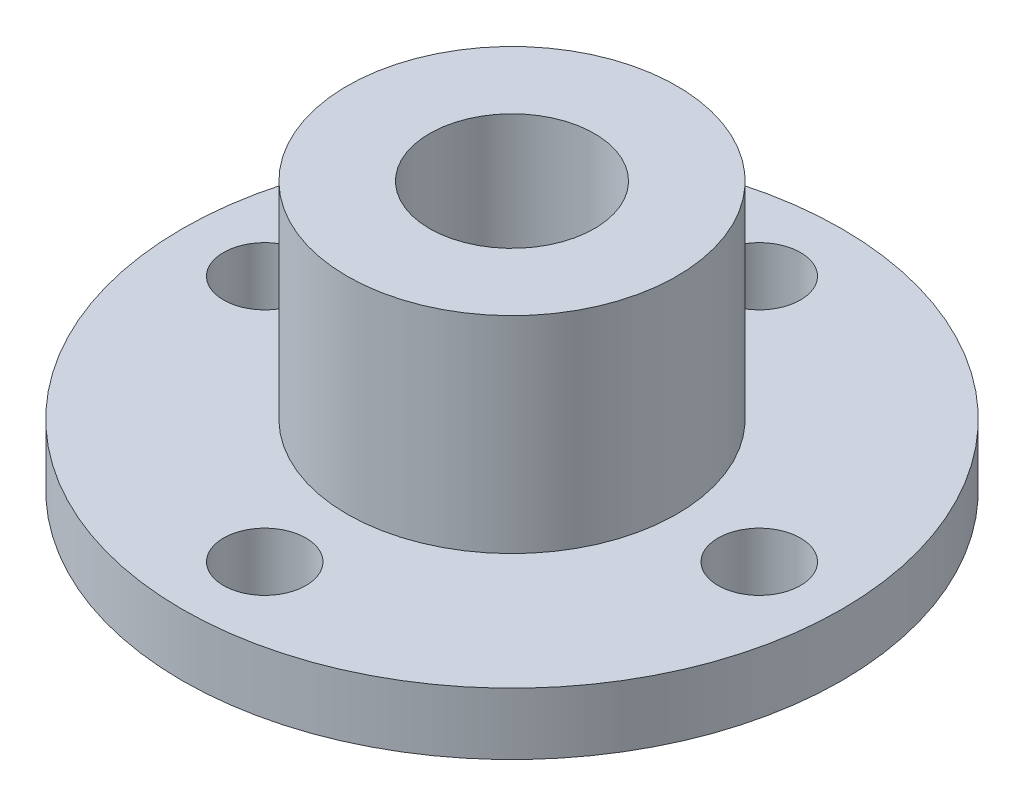
ISO-10303-21;
HEADER;
FILE_DESCRIPTION(('STEP AP214'),'2;1');
FILE_NAME('part.step','',(''),(''),'','','');
FILE_SCHEMA(('AUTOMOTIVE_DESIGN { 1 0 10303 214 1 1 1 1 }'));
ENDSEC;
DATA;
#1=APPLICATION_CONTEXT('core data for automotive mechanical design processes');
#2=APPLICATION_PROTOCOL_DEFINITION('international standard','automotive_design',2000,#1);
#3=PRODUCT_CONTEXT('',#1,'mechanical');
#4=PRODUCT('Part','Part','',(#3));
#5=PRODUCT_RELATED_PRODUCT_CATEGORY('part','',(#4));
#6=PRODUCT_DEFINITION_FORMATION('','',#4);
#7=PRODUCT_DEFINITION_CONTEXT('part definition',#1,'design');
#8=PRODUCT_DEFINITION('design','',#6,#7);
#9=PRODUCT_DEFINITION_SHAPE('','',#8);
#10=(LENGTH_UNIT() NAMED_UNIT(*) SI_UNIT(.MILLI.,.METRE.));
#11=(NAMED_UNIT(*) PLANE_ANGLE_UNIT() SI_UNIT($,.RADIAN.));
#12=(NAMED_UNIT(*) SI_UNIT($,.STERADIAN.) SOLID_ANGLE_UNIT());
#13=UNCERTAINTY_MEASURE_WITH_UNIT(LENGTH_MEASURE(1.E-05),#10,'distance_accuracy_value','');
#14=(GEOMETRIC_REPRESENTATION_CONTEXT(3) GLOBAL_UNCERTAINTY_ASSIGNED_CONTEXT((#13)) GLOBAL_UNIT_ASSIGNED_CONTEXT((#10,
#11,#12)) REPRESENTATION_CONTEXT('',''));
#15=CARTESIAN_POINT('',(0.,0.,0.));
#16=DIRECTION('',(0.,0.,1.));
#17=DIRECTION('',(1.,0.,0.));
#18=AXIS2_PLACEMENT_3D('',#15,#16,#17);
#19=CARTESIAN_POINT('',(0.,3.,0.));
#20=DIRECTION('',(0.,1.,0.));
#21=DIRECTION('',(0.,0.,1.));
#22=AXIS2_PLACEMENT_3D('',#19,#20,#21);
#23=PLANE('',#22);
#24=CARTESIAN_POINT('',(0.,3.,0.));
#25=DIRECTION('',(0.,1.,0.));
#26=DIRECTION('',(0.,0.,1.));
#27=AXIS2_PLACEMENT_3D('',#24,#25,#26);
#28=CIRCLE('',#27,8.);
#29=CARTESIAN_POINT('',(0.,3.,8.));
#30=VERTEX_POINT('',#29);
#31=EDGE_CURVE('E73',#30,#30,#28,.T.);
#32=ORIENTED_EDGE('',*,*,#31,.F.);
#33=EDGE_LOOP('',(#32));
#34=FACE_BOUND('',#33,.T.);
#35=CARTESIAN_POINT('',(0.,3.,12.));
#36=DIRECTION('',(0.,1.,0.));
#37=DIRECTION('',(0.,0.,-1.));
#38=AXIS2_PLACEMENT_3D('',#35,#36,#37);
#39=CIRCLE('',#38,2.);
#40=CARTESIAN_POINT('',(0.,3.,10.));
#41=VERTEX_POINT('',#40);
#42=EDGE_CURVE('E58',#41,#41,#39,.T.);
#43=ORIENTED_EDGE('',*,*,#42,.F.);
#44=EDGE_LOOP('',(#43));
#45=FACE_BOUND('',#44,.T.);
#46=CARTESIAN_POINT('',(-12.,3.,0.));
#47=DIRECTION('',(0.,1.,0.));
#48=DIRECTION('',(0.,0.,1.));
#49=AXIS2_PLACEMENT_3D('',#46,#47,#48);
#50=CIRCLE('',#49,2.);
#51=CARTESIAN_POINT('',(-12.,3.,2.));
#52=VERTEX_POINT('',#51);
#53=EDGE_CURVE('E47',#52,#52,#50,.T.);
#54=ORIENTED_EDGE('',*,*,#53,.F.);
#55=EDGE_LOOP('',(#54));
#56=FACE_BOUND('',#55,.T.);
#57=CARTESIAN_POINT('',(0.,3.,0.));
#58=DIRECTION('',(0.,1.,0.));
#59=DIRECTION('',(0.,0.,1.));
#60=AXIS2_PLACEMENT_3D('',#57,#58,#59);
#61=CIRCLE('',#60,16.);
#62=CARTESIAN_POINT('',(0.,3.,16.));
#63=VERTEX_POINT('',#62);
#64=EDGE_CURVE('E10',#63,#63,#61,.T.);
#65=ORIENTED_EDGE('',*,*,#64,.T.);
#66=EDGE_LOOP('',(#65));
#67=FACE_BOUND('',#66,.T.);
#68=CARTESIAN_POINT('',(12.,3.,0.));
#69=DIRECTION('',(0.,1.,0.));
#70=DIRECTION('',(0.,0.,-1.));
#71=AXIS2_PLACEMENT_3D('',#68,#69,#70);
#72=CIRCLE('',#71,2.);
#73=CARTESIAN_POINT('',(12.,3.,-2.));
#74=VERTEX_POINT('',#73);
#75=EDGE_CURVE('E52',#74,#74,#72,.T.);
#76=ORIENTED_EDGE('',*,*,#75,.F.);
#77=EDGE_LOOP('',(#76));
#78=FACE_BOUND('',#77,.T.);
#79=CARTESIAN_POINT('',(0.,3.,-12.));
#80=DIRECTION('',(0.,1.,0.));
#81=DIRECTION('',(0.,0.,1.));
#82=AXIS2_PLACEMENT_3D('',#79,#80,#81);
#83=CIRCLE('',#82,2.);
#84=CARTESIAN_POINT('',(0.,3.,-10.));
#85=VERTEX_POINT('',#84);
#86=EDGE_CURVE('E64',#85,#85,#83,.T.);
#87=ORIENTED_EDGE('',*,*,#86,.F.);
#88=EDGE_LOOP('',(#87));
#89=FACE_BOUND('',#88,.T.);
#90=ADVANCED_FACE('F36',(#34,#45,#56,#67,#78,#89),#23,.T.);
#91=CARTESIAN_POINT('',(0.,0.,0.));
#92=DIRECTION('',(0.,1.,0.));
#93=DIRECTION('',(0.,0.,1.));
#94=AXIS2_PLACEMENT_3D('',#91,#92,#93);
#95=PLANE('',#94);
#96=CARTESIAN_POINT('',(0.,0.,0.));
#97=DIRECTION('',(0.,1.,0.));
#98=DIRECTION('',(0.,0.,1.));
#99=AXIS2_PLACEMENT_3D('',#96,#97,#98);
#100=CIRCLE('',#99,4.);
#101=CARTESIAN_POINT('',(0.,0.,4.));
#102=VERTEX_POINT('',#101);
#103=EDGE_CURVE('E76',#102,#102,#100,.T.);
#104=ORIENTED_EDGE('',*,*,#103,.T.);
#105=EDGE_LOOP('',(#104));
#106=FACE_BOUND('',#105,.T.);
#107=CARTESIAN_POINT('',(0.,0.,0.));
#108=DIRECTION('',(0.,1.,0.));
#109=DIRECTION('',(0.,0.,1.));
#110=AXIS2_PLACEMENT_3D('',#107,#108,#109);
#111=CIRCLE('',#110,16.);
#112=CARTESIAN_POINT('',(0.,0.,16.));
#113=VERTEX_POINT('',#112);
#114=EDGE_CURVE('E40',#113,#113,#111,.T.);
#115=ORIENTED_EDGE('',*,*,#114,.F.);
#116=EDGE_LOOP('',(#115));
#117=FACE_BOUND('',#116,.T.);
#118=CARTESIAN_POINT('',(-12.,0.,0.));
#119=DIRECTION('',(0.,1.,0.));
#120=DIRECTION('',(0.,0.,1.));
#121=AXIS2_PLACEMENT_3D('',#118,#119,#120);
#122=CIRCLE('',#121,2.);
#123=CARTESIAN_POINT('',(-12.,0.,2.));
#124=VERTEX_POINT('',#123);
#125=EDGE_CURVE('E49',#124,#124,#122,.T.);
#126=ORIENTED_EDGE('',*,*,#125,.T.);
#127=EDGE_LOOP('',(#126));
#128=FACE_BOUND('',#127,.T.);
#129=CARTESIAN_POINT('',(12.,0.,0.));
#130=DIRECTION('',(0.,1.,0.));
#131=DIRECTION('',(0.,0.,-1.));
#132=AXIS2_PLACEMENT_3D('',#129,#130,#131);
#133=CIRCLE('',#132,2.);
#134=CARTESIAN_POINT('',(12.,0.,-2.));
#135=VERTEX_POINT('',#134);
#136=EDGE_CURVE('E55',#135,#135,#133,.T.);
#137=ORIENTED_EDGE('',*,*,#136,.T.);
#138=EDGE_LOOP('',(#137));
#139=FACE_BOUND('',#138,.T.);
#140=CARTESIAN_POINT('',(0.,0.,12.));
#141=DIRECTION('',(0.,1.,0.));
#142=DIRECTION('',(0.,0.,-1.));
#143=AXIS2_PLACEMENT_3D('',#140,#141,#142);
#144=CIRCLE('',#143,2.);
#145=CARTESIAN_POINT('',(0.,0.,10.));
#146=VERTEX_POINT('',#145);
#147=EDGE_CURVE('E61',#146,#146,#144,.T.);
#148=ORIENTED_EDGE('',*,*,#147,.T.);
#149=EDGE_LOOP('',(#148));
#150=FACE_BOUND('',#149,.T.);
#151=CARTESIAN_POINT('',(0.,0.,-12.));
#152=DIRECTION('',(0.,1.,0.));
#153=DIRECTION('',(0.,0.,1.));
#154=AXIS2_PLACEMENT_3D('',#151,#152,#153);
#155=CIRCLE('',#154,2.);
#156=CARTESIAN_POINT('',(0.,0.,-10.));
#157=VERTEX_POINT('',#156);
#158=EDGE_CURVE('E67',#157,#157,#155,.T.);
#159=ORIENTED_EDGE('',*,*,#158,.T.);
#160=EDGE_LOOP('',(#159));
#161=FACE_BOUND('',#160,.T.);
#162=ADVANCED_FACE('F85',(#106,#117,#128,#139,#150,#161),#95,.F.);
#163=CARTESIAN_POINT('',(0.,3.,0.));
#164=DIRECTION('',(0.,-1.,0.));
#165=DIRECTION('',(0.,0.,-1.));
#166=AXIS2_PLACEMENT_3D('',#163,#164,#165);
#167=CYLINDRICAL_SURFACE('',#166,16.);
#168=ORIENTED_EDGE('',*,*,#64,.F.);
#169=EDGE_LOOP('',(#168));
#170=FACE_BOUND('',#169,.T.);
#171=ORIENTED_EDGE('',*,*,#114,.T.);
#172=EDGE_LOOP('',(#171));
#173=FACE_BOUND('',#172,.T.);
#174=ADVANCED_FACE('F38',(#170,#173),#167,.T.);
#175=CARTESIAN_POINT('',(-12.,3.,0.));
#176=DIRECTION('',(0.,-1.,0.));
#177=DIRECTION('',(0.,0.,-1.));
#178=AXIS2_PLACEMENT_3D('',#175,#176,#177);
#179=CYLINDRICAL_SURFACE('',#178,2.);
#180=ORIENTED_EDGE('',*,*,#53,.T.);
#181=EDGE_LOOP('',(#180));
#182=FACE_BOUND('',#181,.T.);
#183=ORIENTED_EDGE('',*,*,#125,.F.);
#184=EDGE_LOOP('',(#183));
#185=FACE_BOUND('',#184,.T.);
#186=ADVANCED_FACE('F128',(#182,#185),#179,.F.);
#187=CARTESIAN_POINT('',(12.,3.,0.));
#188=DIRECTION('',(0.,-1.,0.));
#189=DIRECTION('',(0.,0.,-1.));
#190=AXIS2_PLACEMENT_3D('',#187,#188,#189);
#191=CYLINDRICAL_SURFACE('',#190,2.);
#192=ORIENTED_EDGE('',*,*,#75,.T.);
#193=EDGE_LOOP('',(#192));
#194=FACE_BOUND('',#193,.T.);
#195=ORIENTED_EDGE('',*,*,#136,.F.);
#196=EDGE_LOOP('',(#195));
#197=FACE_BOUND('',#196,.T.);
#198=ADVANCED_FACE('F133',(#194,#197),#191,.F.);
#199=CARTESIAN_POINT('',(0.,3.,12.));
#200=DIRECTION('',(0.,-1.,0.));
#201=DIRECTION('',(0.,0.,-1.));
#202=AXIS2_PLACEMENT_3D('',#199,#200,#201);
#203=CYLINDRICAL_SURFACE('',#202,2.);
#204=ORIENTED_EDGE('',*,*,#42,.T.);
#205=EDGE_LOOP('',(#204));
#206=FACE_BOUND('',#205,.T.);
#207=ORIENTED_EDGE('',*,*,#147,.F.);
#208=EDGE_LOOP('',(#207));
#209=FACE_BOUND('',#208,.T.);
#210=ADVANCED_FACE('F120',(#206,#209),#203,.F.);
#211=CARTESIAN_POINT('',(0.,3.,-12.));
#212=DIRECTION('',(0.,-1.,0.));
#213=DIRECTION('',(0.,0.,-1.));
#214=AXIS2_PLACEMENT_3D('',#211,#212,#213);
#215=CYLINDRICAL_SURFACE('',#214,2.);
#216=ORIENTED_EDGE('',*,*,#86,.T.);
#217=EDGE_LOOP('',(#216));
#218=FACE_BOUND('',#217,.T.);
#219=ORIENTED_EDGE('',*,*,#158,.F.);
#220=EDGE_LOOP('',(#219));
#221=FACE_BOUND('',#220,.T.);
#222=ADVANCED_FACE('F103',(#218,#221),#215,.F.);
#223=CARTESIAN_POINT('',(0.,13.,0.));
#224=DIRECTION('',(0.,-1.,0.));
#225=DIRECTION('',(0.,0.,-1.));
#226=AXIS2_PLACEMENT_3D('',#223,#224,#225);
#227=CYLINDRICAL_SURFACE('',#226,8.);
#228=CARTESIAN_POINT('',(0.,13.,0.));
#229=DIRECTION('',(0.,1.,0.));
#230=DIRECTION('',(0.,0.,1.));
#231=AXIS2_PLACEMENT_3D('',#228,#229,#230);
#232=CIRCLE('',#231,8.);
#233=CARTESIAN_POINT('',(0.,13.,8.));
#234=VERTEX_POINT('',#233);
#235=EDGE_CURVE('E70',#234,#234,#232,.T.);
#236=ORIENTED_EDGE('',*,*,#235,.F.);
#237=EDGE_LOOP('',(#236));
#238=FACE_BOUND('',#237,.T.);
#239=ORIENTED_EDGE('',*,*,#31,.T.);
#240=EDGE_LOOP('',(#239));
#241=FACE_BOUND('',#240,.T.);
#242=ADVANCED_FACE('F97',(#238,#241),#227,.T.);
#243=CARTESIAN_POINT('',(0.,13.,0.));
#244=DIRECTION('',(0.,1.,0.));
#245=DIRECTION('',(0.,0.,1.));
#246=AXIS2_PLACEMENT_3D('',#243,#244,#245);
#247=PLANE('',#246);
#248=CARTESIAN_POINT('',(0.,13.,0.));
#249=DIRECTION('',(0.,1.,0.));
#250=DIRECTION('',(0.,0.,1.));
#251=AXIS2_PLACEMENT_3D('',#248,#249,#250);
#252=CIRCLE('',#251,4.);
#253=CARTESIAN_POINT('',(0.,13.,4.));
#254=VERTEX_POINT('',#253);
#255=EDGE_CURVE('E79',#254,#254,#252,.T.);
#256=ORIENTED_EDGE('',*,*,#255,.F.);
#257=EDGE_LOOP('',(#256));
#258=FACE_BOUND('',#257,.T.);
#259=ORIENTED_EDGE('',*,*,#235,.T.);
#260=EDGE_LOOP('',(#259));
#261=FACE_BOUND('',#260,.T.);
#262=ADVANCED_FACE('F91',(#258,#261),#247,.T.);
#263=CARTESIAN_POINT('',(0.,0.,0.));
#264=DIRECTION('',(0.,1.,0.));
#265=DIRECTION('',(0.,0.,1.));
#266=AXIS2_PLACEMENT_3D('',#263,#264,#265);
#267=CYLINDRICAL_SURFACE('',#266,4.);
#268=ORIENTED_EDGE('',*,*,#103,.F.);
#269=EDGE_LOOP('',(#268));
#270=FACE_BOUND('',#269,.T.);
#271=ORIENTED_EDGE('',*,*,#255,.T.);
#272=EDGE_LOOP('',(#271));
#273=FACE_BOUND('',#272,.T.);
#274=ADVANCED_FACE('F88',(#270,#273),#267,.F.);
#275=CLOSED_SHELL('',(#90,#162,#174,#186,#198,#210,#222,#242,#262,#274));
#276=MANIFOLD_SOLID_BREP('B2',#275);
#277=ADVANCED_BREP_SHAPE_REPRESENTATION('',(#18,#276),#14);
#278=SHAPE_DEFINITION_REPRESENTATION(#9,#277);
ENDSEC;
END-ISO-10303-21;
